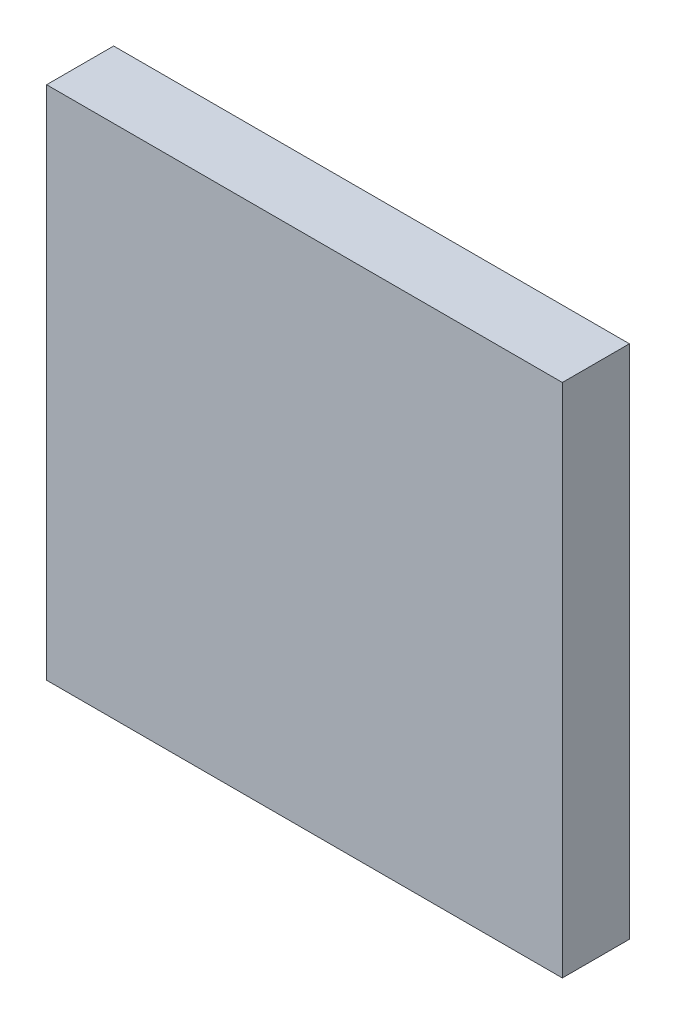
ISO-10303-21;
HEADER;
FILE_DESCRIPTION(('STEP AP214'),'2;1');
FILE_NAME('part.step','',(''),(''),'','','');
FILE_SCHEMA(('AUTOMOTIVE_DESIGN { 1 0 10303 214 1 1 1 1 }'));
ENDSEC;
DATA;
#1=APPLICATION_CONTEXT('core data for automotive mechanical design processes');
#2=APPLICATION_PROTOCOL_DEFINITION('international standard','automotive_design',2000,#1);
#3=PRODUCT_CONTEXT('',#1,'mechanical');
#4=PRODUCT('Part','Part','',(#3));
#5=PRODUCT_RELATED_PRODUCT_CATEGORY('part','',(#4));
#6=PRODUCT_DEFINITION_FORMATION('','',#4);
#7=PRODUCT_DEFINITION_CONTEXT('part definition',#1,'design');
#8=PRODUCT_DEFINITION('design','',#6,#7);
#9=PRODUCT_DEFINITION_SHAPE('','',#8);
#10=(LENGTH_UNIT() NAMED_UNIT(*) SI_UNIT(.MILLI.,.METRE.));
#11=(NAMED_UNIT(*) PLANE_ANGLE_UNIT() SI_UNIT($,.RADIAN.));
#12=(NAMED_UNIT(*) SI_UNIT($,.STERADIAN.) SOLID_ANGLE_UNIT());
#13=UNCERTAINTY_MEASURE_WITH_UNIT(LENGTH_MEASURE(1.E-05),#10,'distance_accuracy_value','');
#14=(GEOMETRIC_REPRESENTATION_CONTEXT(3) GLOBAL_UNCERTAINTY_ASSIGNED_CONTEXT((#13)) GLOBAL_UNIT_ASSIGNED_CONTEXT((#10,
#11,#12)) REPRESENTATION_CONTEXT('',''));
#15=CARTESIAN_POINT('',(0.,0.,0.));
#16=DIRECTION('',(0.,0.,1.));
#17=DIRECTION('',(1.,0.,0.));
#18=AXIS2_PLACEMENT_3D('',#15,#16,#17);
#19=CARTESIAN_POINT('',(-1.92307692307796,15.,0.5));
#20=DIRECTION('',(0.,-1.,0.));
#21=DIRECTION('',(0.,0.,-1.));
#22=AXIS2_PLACEMENT_3D('',#19,#20,#21);
#23=PLANE('',#22);
#24=DIRECTION('',(1.,0.,0.));
#25=VECTOR('',#24,1.);
#26=CARTESIAN_POINT('',(-1.92307692307796,15.,1.));
#27=LINE('',#26,#25);
#28=CARTESIAN_POINT('',(-1.92307692307796,15.,1.));
#29=VERTEX_POINT('',#28);
#30=CARTESIAN_POINT('',(1.92307692307589,15.,1.));
#31=VERTEX_POINT('',#30);
#32=EDGE_CURVE('E105',#29,#31,#27,.T.);
#33=ORIENTED_EDGE('',*,*,#32,.T.);
#34=DIRECTION('',(0.,0.,1.));
#35=VECTOR('',#34,1.);
#36=CARTESIAN_POINT('',(1.92307692307589,15.,0.5));
#37=LINE('',#36,#35);
#38=CARTESIAN_POINT('',(1.92307692307589,15.,0.5));
#39=VERTEX_POINT('',#38);
#40=EDGE_CURVE('E11',#39,#31,#37,.T.);
#41=ORIENTED_EDGE('',*,*,#40,.F.);
#42=DIRECTION('',(1.,0.,0.));
#43=VECTOR('',#42,1.);
#44=CARTESIAN_POINT('',(-1.92307692307796,15.,0.5));
#45=LINE('',#44,#43);
#46=CARTESIAN_POINT('',(-1.92307692307796,15.,0.5));
#47=VERTEX_POINT('',#46);
#48=EDGE_CURVE('E89',#47,#39,#45,.T.);
#49=ORIENTED_EDGE('',*,*,#48,.F.);
#50=DIRECTION('',(0.,0.,1.));
#51=VECTOR('',#50,1.);
#52=CARTESIAN_POINT('',(-1.92307692307796,15.,0.5));
#53=LINE('',#52,#51);
#54=EDGE_CURVE('E97',#47,#29,#53,.T.);
#55=ORIENTED_EDGE('',*,*,#54,.T.);
#56=EDGE_LOOP('',(#33,#41,#49,#55));
#57=FACE_BOUND('',#56,.T.);
#58=ADVANCED_FACE('F39',(#57),#23,.F.);
#59=CARTESIAN_POINT('',(1.92307692307589,15.,0.5));
#60=DIRECTION('',(-1.,0.,0.));
#61=DIRECTION('',(0.,0.,1.));
#62=AXIS2_PLACEMENT_3D('',#59,#60,#61);
#63=PLANE('',#62);
#64=DIRECTION('',(0.,-1.,0.));
#65=VECTOR('',#64,1.);
#66=CARTESIAN_POINT('',(1.92307692307589,15.,1.));
#67=LINE('',#66,#65);
#68=CARTESIAN_POINT('',(1.92307692307589,11.1538461538462,1.));
#69=VERTEX_POINT('',#68);
#70=EDGE_CURVE('E92',#31,#69,#67,.T.);
#71=ORIENTED_EDGE('',*,*,#70,.T.);
#72=DIRECTION('',(0.,0.,1.));
#73=VECTOR('',#72,1.);
#74=CARTESIAN_POINT('',(1.92307692307589,11.1538461538462,0.5));
#75=LINE('',#74,#73);
#76=CARTESIAN_POINT('',(1.92307692307589,11.1538461538462,0.5));
#77=VERTEX_POINT('',#76);
#78=EDGE_CURVE('E50',#77,#69,#75,.T.);
#79=ORIENTED_EDGE('',*,*,#78,.F.);
#80=DIRECTION('',(0.,-1.,0.));
#81=VECTOR('',#80,1.);
#82=CARTESIAN_POINT('',(1.92307692307589,15.,0.5));
#83=LINE('',#82,#81);
#84=EDGE_CURVE('E82',#39,#77,#83,.T.);
#85=ORIENTED_EDGE('',*,*,#84,.F.);
#86=ORIENTED_EDGE('',*,*,#40,.T.);
#87=EDGE_LOOP('',(#71,#79,#85,#86));
#88=FACE_BOUND('',#87,.T.);
#89=ADVANCED_FACE('F93',(#88),#63,.F.);
#90=CARTESIAN_POINT('',(1.92307692307589,11.1538461538462,0.5));
#91=DIRECTION('',(0.,1.,0.));
#92=DIRECTION('',(0.,0.,1.));
#93=AXIS2_PLACEMENT_3D('',#90,#91,#92);
#94=PLANE('',#93);
#95=DIRECTION('',(-1.,0.,0.));
#96=VECTOR('',#95,1.);
#97=CARTESIAN_POINT('',(1.92307692307589,11.1538461538462,1.));
#98=LINE('',#97,#96);
#99=CARTESIAN_POINT('',(-1.92307692307796,11.1538461538462,1.));
#100=VERTEX_POINT('',#99);
#101=EDGE_CURVE('E74',#69,#100,#98,.T.);
#102=ORIENTED_EDGE('',*,*,#101,.T.);
#103=DIRECTION('',(0.,0.,1.));
#104=VECTOR('',#103,1.);
#105=CARTESIAN_POINT('',(-1.92307692307796,11.1538461538462,0.5));
#106=LINE('',#105,#104);
#107=CARTESIAN_POINT('',(-1.92307692307796,11.1538461538462,0.5));
#108=VERTEX_POINT('',#107);
#109=EDGE_CURVE('E94',#108,#100,#106,.T.);
#110=ORIENTED_EDGE('',*,*,#109,.F.);
#111=DIRECTION('',(-1.,0.,0.));
#112=VECTOR('',#111,1.);
#113=CARTESIAN_POINT('',(1.92307692307589,11.1538461538462,0.5));
#114=LINE('',#113,#112);
#115=EDGE_CURVE('E88',#77,#108,#114,.T.);
#116=ORIENTED_EDGE('',*,*,#115,.F.);
#117=ORIENTED_EDGE('',*,*,#78,.T.);
#118=EDGE_LOOP('',(#102,#110,#116,#117));
#119=FACE_BOUND('',#118,.T.);
#120=ADVANCED_FACE('F96',(#119),#94,.F.);
#121=CARTESIAN_POINT('',(-1.92307692307796,11.1538461538462,0.5));
#122=DIRECTION('',(1.,0.,0.));
#123=DIRECTION('',(0.,0.,-1.));
#124=AXIS2_PLACEMENT_3D('',#121,#122,#123);
#125=PLANE('',#124);
#126=DIRECTION('',(0.,1.,0.));
#127=VECTOR('',#126,1.);
#128=CARTESIAN_POINT('',(-1.92307692307796,11.1538461538462,1.));
#129=LINE('',#128,#127);
#130=EDGE_CURVE('E76',#100,#29,#129,.T.);
#131=ORIENTED_EDGE('',*,*,#130,.T.);
#132=ORIENTED_EDGE('',*,*,#54,.F.);
#133=DIRECTION('',(0.,1.,0.));
#134=VECTOR('',#133,1.);
#135=CARTESIAN_POINT('',(-1.92307692307796,11.1538461538462,0.5));
#136=LINE('',#135,#134);
#137=EDGE_CURVE('E54',#108,#47,#136,.T.);
#138=ORIENTED_EDGE('',*,*,#137,.F.);
#139=ORIENTED_EDGE('',*,*,#109,.T.);
#140=EDGE_LOOP('',(#131,#132,#138,#139));
#141=FACE_BOUND('',#140,.T.);
#142=ADVANCED_FACE('F106',(#141),#125,.F.);
#143=CARTESIAN_POINT('',(0.,0.,0.5));
#144=DIRECTION('',(0.,0.,-1.));
#145=DIRECTION('',(-1.,0.,0.));
#146=AXIS2_PLACEMENT_3D('',#143,#144,#145);
#147=PLANE('',#146);
#148=ORIENTED_EDGE('',*,*,#48,.T.);
#149=ORIENTED_EDGE('',*,*,#84,.T.);
#150=ORIENTED_EDGE('',*,*,#115,.T.);
#151=ORIENTED_EDGE('',*,*,#137,.T.);
#152=EDGE_LOOP('',(#148,#149,#150,#151));
#153=FACE_BOUND('',#152,.T.);
#154=ADVANCED_FACE('F86',(#153),#147,.T.);
#155=CARTESIAN_POINT('',(0.,0.,1.));
#156=DIRECTION('',(0.,0.,-1.));
#157=DIRECTION('',(-1.,0.,0.));
#158=AXIS2_PLACEMENT_3D('',#155,#156,#157);
#159=PLANE('',#158);
#160=ORIENTED_EDGE('',*,*,#32,.F.);
#161=ORIENTED_EDGE('',*,*,#130,.F.);
#162=ORIENTED_EDGE('',*,*,#101,.F.);
#163=ORIENTED_EDGE('',*,*,#70,.F.);
#164=EDGE_LOOP('',(#160,#161,#162,#163));
#165=FACE_BOUND('',#164,.T.);
#166=ADVANCED_FACE('F115',(#165),#159,.F.);
#167=CLOSED_SHELL('',(#58,#89,#120,#142,#154,#166));
#168=MANIFOLD_SOLID_BREP('B2',#167);
#169=ADVANCED_BREP_SHAPE_REPRESENTATION('',(#18,#168),#14);
#170=SHAPE_DEFINITION_REPRESENTATION(#9,#169);
ENDSEC;
END-ISO-10303-21;
